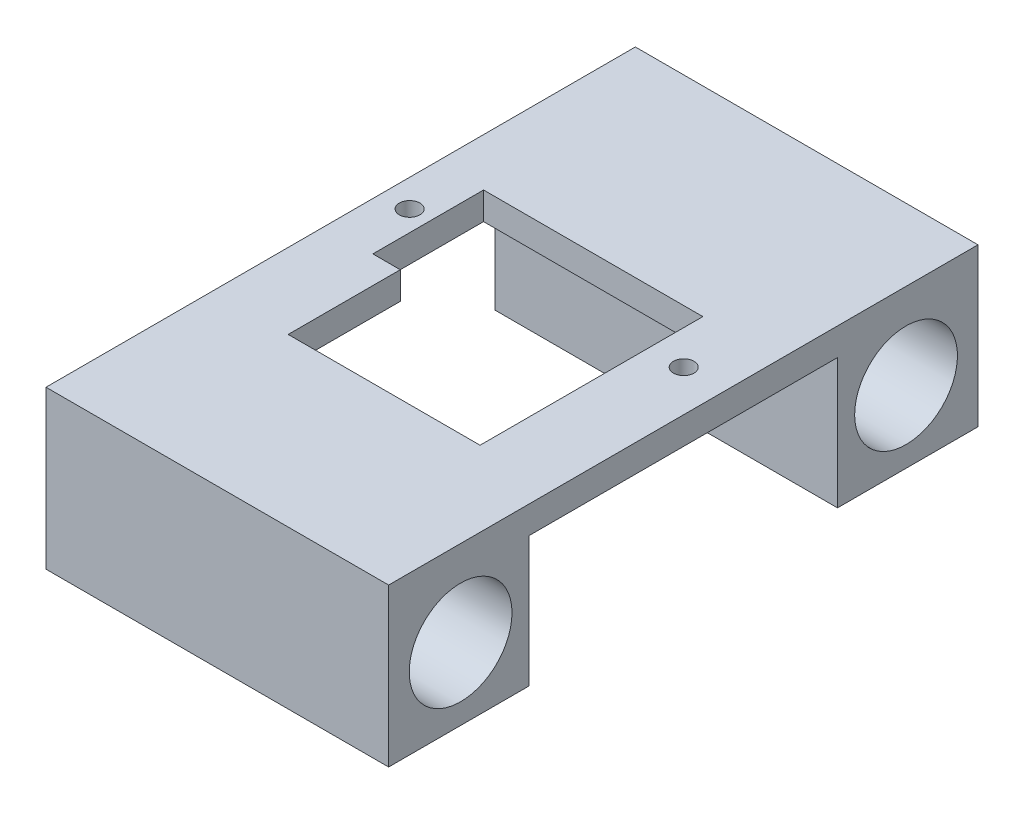
ISO-10303-21;
HEADER;
FILE_DESCRIPTION(('STEP AP214'),'2;1');
FILE_NAME('part.step','',(''),(''),'','','');
FILE_SCHEMA(('AUTOMOTIVE_DESIGN { 1 0 10303 214 1 1 1 1 }'));
ENDSEC;
DATA;
#1=APPLICATION_CONTEXT('core data for automotive mechanical design processes');
#2=APPLICATION_PROTOCOL_DEFINITION('international standard','automotive_design',2000,#1);
#3=PRODUCT_CONTEXT('',#1,'mechanical');
#4=PRODUCT('Part','Part','',(#3));
#5=PRODUCT_RELATED_PRODUCT_CATEGORY('part','',(#4));
#6=PRODUCT_DEFINITION_FORMATION('','',#4);
#7=PRODUCT_DEFINITION_CONTEXT('part definition',#1,'design');
#8=PRODUCT_DEFINITION('design','',#6,#7);
#9=PRODUCT_DEFINITION_SHAPE('','',#8);
#10=(LENGTH_UNIT() NAMED_UNIT(*) SI_UNIT(.MILLI.,.METRE.));
#11=(NAMED_UNIT(*) PLANE_ANGLE_UNIT() SI_UNIT($,.RADIAN.));
#12=(NAMED_UNIT(*) SI_UNIT($,.STERADIAN.) SOLID_ANGLE_UNIT());
#13=UNCERTAINTY_MEASURE_WITH_UNIT(LENGTH_MEASURE(1.E-05),#10,'distance_accuracy_value','');
#14=(GEOMETRIC_REPRESENTATION_CONTEXT(3) GLOBAL_UNCERTAINTY_ASSIGNED_CONTEXT((#13)) GLOBAL_UNIT_ASSIGNED_CONTEXT((#10,
#11,#12)) REPRESENTATION_CONTEXT('',''));
#15=CARTESIAN_POINT('',(0.,0.,0.));
#16=DIRECTION('',(0.,0.,1.));
#17=DIRECTION('',(1.,0.,0.));
#18=AXIS2_PLACEMENT_3D('',#15,#16,#17);
#19=CARTESIAN_POINT('',(-25.,-10.5,32.5));
#20=DIRECTION('',(0.,-1.,0.));
#21=DIRECTION('',(0.,0.,-1.));
#22=AXIS2_PLACEMENT_3D('',#19,#20,#21);
#23=PLANE('',#22);
#24=DIRECTION('',(-1.,0.,0.));
#25=VECTOR('',#24,1.);
#26=CARTESIAN_POINT('',(37.0000000000001,-10.5,-22.5));
#27=LINE('',#26,#25);
#28=CARTESIAN_POINT('',(25.,-10.5,-22.5));
#29=VERTEX_POINT('',#28);
#30=CARTESIAN_POINT('',(-25.,-10.5,-22.5));
#31=VERTEX_POINT('',#30);
#32=EDGE_CURVE('E374',#29,#31,#27,.T.);
#33=ORIENTED_EDGE('',*,*,#32,.T.);
#34=DIRECTION('',(0.,0.,-1.));
#35=VECTOR('',#34,1.);
#36=CARTESIAN_POINT('',(-25.,-10.5,-43.));
#37=LINE('',#36,#35);
#38=CARTESIAN_POINT('',(-25.,-10.5,-43.));
#39=VERTEX_POINT('',#38);
#40=EDGE_CURVE('E168',#31,#39,#37,.T.);
#41=ORIENTED_EDGE('',*,*,#40,.T.);
#42=DIRECTION('',(1.,0.,0.));
#43=VECTOR('',#42,1.);
#44=CARTESIAN_POINT('',(-25.,-10.5,-43.));
#45=LINE('',#44,#43);
#46=CARTESIAN_POINT('',(25.,-10.5,-43.));
#47=VERTEX_POINT('',#46);
#48=EDGE_CURVE('E186',#39,#47,#45,.T.);
#49=ORIENTED_EDGE('',*,*,#48,.T.);
#50=DIRECTION('',(0.,0.,-1.));
#51=VECTOR('',#50,1.);
#52=CARTESIAN_POINT('',(25.,-10.5,32.5));
#53=LINE('',#52,#51);
#54=EDGE_CURVE('E200',#29,#47,#53,.T.);
#55=ORIENTED_EDGE('',*,*,#54,.F.);
#56=EDGE_LOOP('',(#33,#41,#49,#55));
#57=FACE_BOUND('',#56,.T.);
#58=ADVANCED_FACE('F39',(#57),#23,.T.);
#59=DIRECTION('',(-1.,0.,0.));
#60=VECTOR('',#59,1.);
#61=CARTESIAN_POINT('',(37.0000000000001,-10.5,22.5));
#62=LINE('',#61,#60);
#63=CARTESIAN_POINT('',(25.,-10.5,22.5));
#64=VERTEX_POINT('',#63);
#65=CARTESIAN_POINT('',(-25.,-10.5,22.5));
#66=VERTEX_POINT('',#65);
#67=EDGE_CURVE('E138',#64,#66,#62,.T.);
#68=ORIENTED_EDGE('',*,*,#67,.F.);
#69=CARTESIAN_POINT('',(25.,-10.5,43.));
#70=VERTEX_POINT('',#69);
#71=EDGE_CURVE('E175',#70,#64,#53,.T.);
#72=ORIENTED_EDGE('',*,*,#71,.F.);
#73=DIRECTION('',(1.,0.,0.));
#74=VECTOR('',#73,1.);
#75=CARTESIAN_POINT('',(-25.,-10.5,43.));
#76=LINE('',#75,#74);
#77=CARTESIAN_POINT('',(-25.,-10.5,43.));
#78=VERTEX_POINT('',#77);
#79=EDGE_CURVE('E164',#78,#70,#76,.T.);
#80=ORIENTED_EDGE('',*,*,#79,.F.);
#81=EDGE_CURVE('E155',#78,#66,#37,.T.);
#82=ORIENTED_EDGE('',*,*,#81,.T.);
#83=EDGE_LOOP('',(#68,#72,#80,#82));
#84=FACE_BOUND('',#83,.T.);
#85=ADVANCED_FACE('F163',(#84),#23,.T.);
#86=CARTESIAN_POINT('',(-25.,12.5,43.));
#87=DIRECTION('',(0.,0.,1.));
#88=DIRECTION('',(1.,0.,0.));
#89=AXIS2_PLACEMENT_3D('',#86,#87,#88);
#90=PLANE('',#89);
#91=DIRECTION('',(0.,-1.,0.));
#92=VECTOR('',#91,1.);
#93=CARTESIAN_POINT('',(25.,12.5,43.));
#94=LINE('',#93,#92);
#95=CARTESIAN_POINT('',(25.,12.5,43.));
#96=VERTEX_POINT('',#95);
#97=EDGE_CURVE('E196',#96,#70,#94,.T.);
#98=ORIENTED_EDGE('',*,*,#97,.F.);
#99=DIRECTION('',(1.,0.,0.));
#100=VECTOR('',#99,1.);
#101=CARTESIAN_POINT('',(-25.,12.5,43.));
#102=LINE('',#101,#100);
#103=CARTESIAN_POINT('',(-25.,12.5,43.));
#104=VERTEX_POINT('',#103);
#105=EDGE_CURVE('E206',#104,#96,#102,.T.);
#106=ORIENTED_EDGE('',*,*,#105,.F.);
#107=DIRECTION('',(0.,-1.,0.));
#108=VECTOR('',#107,1.);
#109=CARTESIAN_POINT('',(-25.,12.5,43.));
#110=LINE('',#109,#108);
#111=EDGE_CURVE('E183',#104,#78,#110,.T.);
#112=ORIENTED_EDGE('',*,*,#111,.T.);
#113=ORIENTED_EDGE('',*,*,#79,.T.);
#114=EDGE_LOOP('',(#98,#106,#112,#113));
#115=FACE_BOUND('',#114,.T.);
#116=ADVANCED_FACE('F300',(#115),#90,.T.);
#117=CARTESIAN_POINT('',(-25.,12.5,-43.));
#118=DIRECTION('',(0.,1.,0.));
#119=DIRECTION('',(0.,0.,1.));
#120=AXIS2_PLACEMENT_3D('',#117,#118,#119);
#121=PLANE('',#120);
#122=CARTESIAN_POINT('',(-21.0000000000012,12.5,-6.05860568349207));
#123=DIRECTION('',(0.,1.,0.));
#124=DIRECTION('',(0.,0.,1.));
#125=AXIS2_PLACEMENT_3D('',#122,#123,#124);
#126=CIRCLE('',#125,1.50000000000298);
#127=CARTESIAN_POINT('',(-21.0000000000012,12.5,-4.55860568348909));
#128=VERTEX_POINT('',#127);
#129=EDGE_CURVE('E161',#128,#128,#126,.T.);
#130=ORIENTED_EDGE('',*,*,#129,.F.);
#131=EDGE_LOOP('',(#130));
#132=FACE_BOUND('',#131,.T.);
#133=CARTESIAN_POINT('',(18.9999999999988,12.5,-6.05860568349166));
#134=DIRECTION('',(0.,1.,0.));
#135=DIRECTION('',(0.,0.,1.));
#136=AXIS2_PLACEMENT_3D('',#133,#134,#135);
#137=CIRCLE('',#136,1.50000000000299);
#138=CARTESIAN_POINT('',(18.9999999999988,12.5,-4.55860568348867));
#139=VERTEX_POINT('',#138);
#140=EDGE_CURVE('E318',#139,#139,#137,.T.);
#141=ORIENTED_EDGE('',*,*,#140,.F.);
#142=EDGE_LOOP('',(#141));
#143=FACE_BOUND('',#142,.T.);
#144=DIRECTION('',(0.,0.,-1.));
#145=VECTOR('',#144,1.);
#146=CARTESIAN_POINT('',(14.0000000000025,12.5,-43.));
#147=LINE('',#146,#145);
#148=CARTESIAN_POINT('',(14.0000000000025,12.5,18.6606856550326));
#149=VERTEX_POINT('',#148);
#150=CARTESIAN_POINT('',(14.0000000000025,12.5,-13.8507985432631));
#151=VERTEX_POINT('',#150);
#152=EDGE_CURVE('E230',#149,#151,#147,.T.);
#153=ORIENTED_EDGE('',*,*,#152,.F.);
#154=DIRECTION('',(1.,0.,0.));
#155=VECTOR('',#154,1.);
#156=CARTESIAN_POINT('',(-25.,12.5,18.6606856550326));
#157=LINE('',#156,#155);
#158=CARTESIAN_POINT('',(-13.9999999999977,12.5,18.6606856550326));
#159=VERTEX_POINT('',#158);
#160=EDGE_CURVE('E205',#159,#149,#157,.T.);
#161=ORIENTED_EDGE('',*,*,#160,.F.);
#162=DIRECTION('',(2.35448277834634E-13,0.,1.));
#163=VECTOR('',#162,1.);
#164=CARTESIAN_POINT('',(-14.0000000000122,12.5,-43.0000000000026));
#165=LINE('',#164,#163);
#166=CARTESIAN_POINT('',(-14.0000000000015,12.5,2.30428605811857));
#167=VERTEX_POINT('',#166);
#168=EDGE_CURVE('E217',#167,#159,#165,.T.);
#169=ORIENTED_EDGE('',*,*,#168,.F.);
#170=DIRECTION('',(1.,0.,0.));
#171=VECTOR('',#170,1.);
#172=CARTESIAN_POINT('',(-25.,12.5,2.30428605811857));
#173=LINE('',#172,#171);
#174=CARTESIAN_POINT('',(-18.0000000000015,12.5,2.30428605811857));
#175=VERTEX_POINT('',#174);
#176=EDGE_CURVE('E221',#175,#167,#173,.T.);
#177=ORIENTED_EDGE('',*,*,#176,.F.);
#178=DIRECTION('',(0.,0.,1.));
#179=VECTOR('',#178,1.);
#180=CARTESIAN_POINT('',(-18.0000000000018,12.5,-43.));
#181=LINE('',#180,#179);
#182=CARTESIAN_POINT('',(-18.0000000000016,12.5,-13.8507985432631));
#183=VERTEX_POINT('',#182);
#184=EDGE_CURVE('E224',#183,#175,#181,.T.);
#185=ORIENTED_EDGE('',*,*,#184,.F.);
#186=DIRECTION('',(-1.,0.,0.));
#187=VECTOR('',#186,1.);
#188=CARTESIAN_POINT('',(-25.,12.5,-13.8507985432631));
#189=LINE('',#188,#187);
#190=EDGE_CURVE('E227',#151,#183,#189,.T.);
#191=ORIENTED_EDGE('',*,*,#190,.F.);
#192=EDGE_LOOP('',(#153,#161,#169,#177,#185,#191));
#193=FACE_BOUND('',#192,.T.);
#194=DIRECTION('',(0.,0.,1.));
#195=VECTOR('',#194,1.);
#196=CARTESIAN_POINT('',(25.,12.5,-43.));
#197=LINE('',#196,#195);
#198=CARTESIAN_POINT('',(25.,12.5,-43.));
#199=VERTEX_POINT('',#198);
#200=EDGE_CURVE('E191',#199,#96,#197,.T.);
#201=ORIENTED_EDGE('',*,*,#200,.F.);
#202=DIRECTION('',(1.,0.,0.));
#203=VECTOR('',#202,1.);
#204=CARTESIAN_POINT('',(-25.,12.5,-43.));
#205=LINE('',#204,#203);
#206=CARTESIAN_POINT('',(-25.,12.5,-43.));
#207=VERTEX_POINT('',#206);
#208=EDGE_CURVE('E209',#207,#199,#205,.T.);
#209=ORIENTED_EDGE('',*,*,#208,.F.);
#210=DIRECTION('',(0.,0.,1.));
#211=VECTOR('',#210,1.);
#212=CARTESIAN_POINT('',(-25.,12.5,-43.));
#213=LINE('',#212,#211);
#214=EDGE_CURVE('E173',#207,#104,#213,.T.);
#215=ORIENTED_EDGE('',*,*,#214,.T.);
#216=ORIENTED_EDGE('',*,*,#105,.T.);
#217=EDGE_LOOP('',(#201,#209,#215,#216));
#218=FACE_BOUND('',#217,.T.);
#219=ADVANCED_FACE('F304',(#132,#143,#193,#218),#121,.T.);
#220=CARTESIAN_POINT('',(-25.,-10.5,-43.));
#221=DIRECTION('',(0.,0.,-1.));
#222=DIRECTION('',(-1.,0.,0.));
#223=AXIS2_PLACEMENT_3D('',#220,#221,#222);
#224=PLANE('',#223);
#225=DIRECTION('',(0.,1.,0.));
#226=VECTOR('',#225,1.);
#227=CARTESIAN_POINT('',(25.,-10.5,-43.));
#228=LINE('',#227,#226);
#229=EDGE_CURVE('E187',#47,#199,#228,.T.);
#230=ORIENTED_EDGE('',*,*,#229,.F.);
#231=ORIENTED_EDGE('',*,*,#48,.F.);
#232=DIRECTION('',(0.,1.,0.));
#233=VECTOR('',#232,1.);
#234=CARTESIAN_POINT('',(-25.,-10.5,-43.));
#235=LINE('',#234,#233);
#236=EDGE_CURVE('E167',#39,#207,#235,.T.);
#237=ORIENTED_EDGE('',*,*,#236,.T.);
#238=ORIENTED_EDGE('',*,*,#208,.T.);
#239=EDGE_LOOP('',(#230,#231,#237,#238));
#240=FACE_BOUND('',#239,.T.);
#241=ADVANCED_FACE('F41',(#240),#224,.T.);
#242=CARTESIAN_POINT('',(-25.,0.,0.));
#243=DIRECTION('',(1.,0.,0.));
#244=DIRECTION('',(0.,0.,-1.));
#245=AXIS2_PLACEMENT_3D('',#242,#243,#244);
#246=PLANE('',#245);
#247=CARTESIAN_POINT('',(-25.,0.,-32.5));
#248=DIRECTION('',(1.,0.,0.));
#249=DIRECTION('',(0.,0.,1.));
#250=AXIS2_PLACEMENT_3D('',#247,#248,#249);
#251=CIRCLE('',#250,7.5);
#252=CARTESIAN_POINT('',(-25.,0.,-25.));
#253=VERTEX_POINT('',#252);
#254=EDGE_CURVE('E261',#253,#253,#251,.T.);
#255=ORIENTED_EDGE('',*,*,#254,.T.);
#256=EDGE_LOOP('',(#255));
#257=FACE_BOUND('',#256,.T.);
#258=CARTESIAN_POINT('',(-25.,0.,32.5));
#259=DIRECTION('',(1.,0.,0.));
#260=DIRECTION('',(0.,0.,-1.));
#261=AXIS2_PLACEMENT_3D('',#258,#259,#260);
#262=CIRCLE('',#261,7.5);
#263=CARTESIAN_POINT('',(-25.,0.,25.));
#264=VERTEX_POINT('',#263);
#265=EDGE_CURVE('E192',#264,#264,#262,.T.);
#266=ORIENTED_EDGE('',*,*,#265,.T.);
#267=EDGE_LOOP('',(#266));
#268=FACE_BOUND('',#267,.T.);
#269=ORIENTED_EDGE('',*,*,#40,.F.);
#270=DIRECTION('',(0.,-1.,0.));
#271=VECTOR('',#270,1.);
#272=CARTESIAN_POINT('',(-25.,-10.5,-22.5));
#273=LINE('',#272,#271);
#274=CARTESIAN_POINT('',(-25.,8.5,-22.5));
#275=VERTEX_POINT('',#274);
#276=EDGE_CURVE('E149',#275,#31,#273,.T.);
#277=ORIENTED_EDGE('',*,*,#276,.F.);
#278=DIRECTION('',(0.,0.,-1.));
#279=VECTOR('',#278,1.);
#280=CARTESIAN_POINT('',(-25.,8.5,-22.5));
#281=LINE('',#280,#279);
#282=CARTESIAN_POINT('',(-25.,8.5,22.5));
#283=VERTEX_POINT('',#282);
#284=EDGE_CURVE('E159',#283,#275,#281,.T.);
#285=ORIENTED_EDGE('',*,*,#284,.F.);
#286=DIRECTION('',(0.,1.,0.));
#287=VECTOR('',#286,1.);
#288=CARTESIAN_POINT('',(-25.,8.5,22.5));
#289=LINE('',#288,#287);
#290=EDGE_CURVE('E141',#66,#283,#289,.T.);
#291=ORIENTED_EDGE('',*,*,#290,.F.);
#292=ORIENTED_EDGE('',*,*,#81,.F.);
#293=ORIENTED_EDGE('',*,*,#111,.F.);
#294=ORIENTED_EDGE('',*,*,#214,.F.);
#295=ORIENTED_EDGE('',*,*,#236,.F.);
#296=EDGE_LOOP('',(#269,#277,#285,#291,#292,#293,#294,#295));
#297=FACE_BOUND('',#296,.T.);
#298=ADVANCED_FACE('F153',(#257,#268,#297),#246,.F.);
#299=CARTESIAN_POINT('',(25.,0.,0.));
#300=DIRECTION('',(1.,0.,0.));
#301=DIRECTION('',(0.,0.,-1.));
#302=AXIS2_PLACEMENT_3D('',#299,#300,#301);
#303=PLANE('',#302);
#304=DIRECTION('',(0.,1.,0.));
#305=VECTOR('',#304,1.);
#306=CARTESIAN_POINT('',(25.,0.,-22.5));
#307=LINE('',#306,#305);
#308=CARTESIAN_POINT('',(25.,8.5,-22.5));
#309=VERTEX_POINT('',#308);
#310=EDGE_CURVE('E11',#29,#309,#307,.T.);
#311=ORIENTED_EDGE('',*,*,#310,.F.);
#312=ORIENTED_EDGE('',*,*,#54,.T.);
#313=ORIENTED_EDGE('',*,*,#229,.T.);
#314=ORIENTED_EDGE('',*,*,#200,.T.);
#315=ORIENTED_EDGE('',*,*,#97,.T.);
#316=ORIENTED_EDGE('',*,*,#71,.T.);
#317=DIRECTION('',(0.,-1.,0.));
#318=VECTOR('',#317,1.);
#319=CARTESIAN_POINT('',(25.,0.,22.5));
#320=LINE('',#319,#318);
#321=CARTESIAN_POINT('',(25.,8.5,22.5));
#322=VERTEX_POINT('',#321);
#323=EDGE_CURVE('E48',#322,#64,#320,.T.);
#324=ORIENTED_EDGE('',*,*,#323,.F.);
#325=DIRECTION('',(0.,0.,1.));
#326=VECTOR('',#325,1.);
#327=CARTESIAN_POINT('',(25.,8.5,0.));
#328=LINE('',#327,#326);
#329=EDGE_CURVE('E257',#309,#322,#328,.T.);
#330=ORIENTED_EDGE('',*,*,#329,.F.);
#331=EDGE_LOOP('',(#311,#312,#313,#314,#315,#316,#324,#330));
#332=FACE_BOUND('',#331,.T.);
#333=CARTESIAN_POINT('',(25.,0.,-32.5));
#334=DIRECTION('',(1.,0.,0.));
#335=DIRECTION('',(0.,0.,1.));
#336=AXIS2_PLACEMENT_3D('',#333,#334,#335);
#337=CIRCLE('',#336,7.5);
#338=CARTESIAN_POINT('',(25.,0.,-25.));
#339=VERTEX_POINT('',#338);
#340=EDGE_CURVE('E265',#339,#339,#337,.T.);
#341=ORIENTED_EDGE('',*,*,#340,.F.);
#342=EDGE_LOOP('',(#341));
#343=FACE_BOUND('',#342,.T.);
#344=CARTESIAN_POINT('',(25.,0.,32.5));
#345=DIRECTION('',(1.,0.,0.));
#346=DIRECTION('',(0.,0.,-1.));
#347=AXIS2_PLACEMENT_3D('',#344,#345,#346);
#348=CIRCLE('',#347,7.5);
#349=CARTESIAN_POINT('',(25.,0.,25.));
#350=VERTEX_POINT('',#349);
#351=EDGE_CURVE('E177',#350,#350,#348,.T.);
#352=ORIENTED_EDGE('',*,*,#351,.F.);
#353=EDGE_LOOP('',(#352));
#354=FACE_BOUND('',#353,.T.);
#355=ADVANCED_FACE('F279',(#332,#343,#354),#303,.T.);
#356=CARTESIAN_POINT('',(-25.,0.,32.5));
#357=DIRECTION('',(1.,0.,0.));
#358=DIRECTION('',(0.,0.,-1.));
#359=AXIS2_PLACEMENT_3D('',#356,#357,#358);
#360=CYLINDRICAL_SURFACE('',#359,7.5);
#361=ORIENTED_EDGE('',*,*,#265,.F.);
#362=EDGE_LOOP('',(#361));
#363=FACE_BOUND('',#362,.T.);
#364=ORIENTED_EDGE('',*,*,#351,.T.);
#365=EDGE_LOOP('',(#364));
#366=FACE_BOUND('',#365,.T.);
#367=ADVANCED_FACE('F277',(#363,#366),#360,.F.);
#368=CARTESIAN_POINT('',(-25.,0.,-32.5));
#369=DIRECTION('',(1.,0.,0.));
#370=DIRECTION('',(0.,0.,-1.));
#371=AXIS2_PLACEMENT_3D('',#368,#369,#370);
#372=CYLINDRICAL_SURFACE('',#371,7.5);
#373=ORIENTED_EDGE('',*,*,#254,.F.);
#374=EDGE_LOOP('',(#373));
#375=FACE_BOUND('',#374,.T.);
#376=ORIENTED_EDGE('',*,*,#340,.T.);
#377=EDGE_LOOP('',(#376));
#378=FACE_BOUND('',#377,.T.);
#379=ADVANCED_FACE('F287',(#375,#378),#372,.F.);
#380=CARTESIAN_POINT('',(14.0000000000025,23.5,-13.8507985432631));
#381=DIRECTION('',(1.,0.,0.));
#382=DIRECTION('',(0.,0.,-1.));
#383=AXIS2_PLACEMENT_3D('',#380,#381,#382);
#384=PLANE('',#383);
#385=DIRECTION('',(0.,-1.,0.));
#386=VECTOR('',#385,1.);
#387=CARTESIAN_POINT('',(14.0000000000025,23.5,-13.8507985432631));
#388=LINE('',#387,#386);
#389=CARTESIAN_POINT('',(14.0000000000025,8.5,-13.8507985432631));
#390=VERTEX_POINT('',#389);
#391=EDGE_CURVE('E268',#151,#390,#388,.T.);
#392=ORIENTED_EDGE('',*,*,#391,.T.);
#393=DIRECTION('',(0.,0.,1.));
#394=VECTOR('',#393,1.);
#395=CARTESIAN_POINT('',(14.0000000000025,8.5,-13.8507985432631));
#396=LINE('',#395,#394);
#397=CARTESIAN_POINT('',(14.0000000000025,8.5,18.6606856550326));
#398=VERTEX_POINT('',#397);
#399=EDGE_CURVE('E333',#390,#398,#396,.T.);
#400=ORIENTED_EDGE('',*,*,#399,.T.);
#401=DIRECTION('',(0.,-1.,0.));
#402=VECTOR('',#401,1.);
#403=CARTESIAN_POINT('',(14.0000000000025,23.5,18.6606856550326));
#404=LINE('',#403,#402);
#405=EDGE_CURVE('E242',#149,#398,#404,.T.);
#406=ORIENTED_EDGE('',*,*,#405,.F.);
#407=ORIENTED_EDGE('',*,*,#152,.T.);
#408=EDGE_LOOP('',(#392,#400,#406,#407));
#409=FACE_BOUND('',#408,.T.);
#410=ADVANCED_FACE('F361',(#409),#384,.F.);
#411=CARTESIAN_POINT('',(14.0000000000025,23.5,-13.8507985432631));
#412=DIRECTION('',(0.,0.,-1.));
#413=DIRECTION('',(-1.,0.,0.));
#414=AXIS2_PLACEMENT_3D('',#411,#412,#413);
#415=PLANE('',#414);
#416=DIRECTION('',(0.,-1.,0.));
#417=VECTOR('',#416,1.);
#418=CARTESIAN_POINT('',(-18.0000000000016,23.5,-13.8507985432631));
#419=LINE('',#418,#417);
#420=CARTESIAN_POINT('',(-18.0000000000016,8.5,-13.8507985432631));
#421=VERTEX_POINT('',#420);
#422=EDGE_CURVE('E343',#183,#421,#419,.T.);
#423=ORIENTED_EDGE('',*,*,#422,.T.);
#424=DIRECTION('',(1.,0.,0.));
#425=VECTOR('',#424,1.);
#426=CARTESIAN_POINT('',(14.0000000000025,8.5,-13.8507985432631));
#427=LINE('',#426,#425);
#428=EDGE_CURVE('E336',#421,#390,#427,.T.);
#429=ORIENTED_EDGE('',*,*,#428,.T.);
#430=ORIENTED_EDGE('',*,*,#391,.F.);
#431=ORIENTED_EDGE('',*,*,#190,.T.);
#432=EDGE_LOOP('',(#423,#429,#430,#431));
#433=FACE_BOUND('',#432,.T.);
#434=ADVANCED_FACE('F366',(#433),#415,.F.);
#435=CARTESIAN_POINT('',(-18.0000000000016,23.5,-13.8507985432631));
#436=DIRECTION('',(-1.,0.,0.));
#437=DIRECTION('',(0.,0.,1.));
#438=AXIS2_PLACEMENT_3D('',#435,#436,#437);
#439=PLANE('',#438);
#440=DIRECTION('',(0.,-1.,0.));
#441=VECTOR('',#440,1.);
#442=CARTESIAN_POINT('',(-18.0000000000015,23.5,2.30428605811857));
#443=LINE('',#442,#441);
#444=CARTESIAN_POINT('',(-18.0000000000015,8.5,2.30428605811857));
#445=VERTEX_POINT('',#444);
#446=EDGE_CURVE('E255',#175,#445,#443,.T.);
#447=ORIENTED_EDGE('',*,*,#446,.T.);
#448=DIRECTION('',(0.,0.,-1.));
#449=VECTOR('',#448,1.);
#450=CARTESIAN_POINT('',(-18.0000000000016,8.5,-13.8507985432631));
#451=LINE('',#450,#449);
#452=EDGE_CURVE('E353',#445,#421,#451,.T.);
#453=ORIENTED_EDGE('',*,*,#452,.T.);
#454=ORIENTED_EDGE('',*,*,#422,.F.);
#455=ORIENTED_EDGE('',*,*,#184,.T.);
#456=EDGE_LOOP('',(#447,#453,#454,#455));
#457=FACE_BOUND('',#456,.T.);
#458=ADVANCED_FACE('F351',(#457),#439,.F.);
#459=CARTESIAN_POINT('',(-18.0000000000015,23.5,2.30428605811857));
#460=DIRECTION('',(0.,0.,1.));
#461=DIRECTION('',(1.,0.,0.));
#462=AXIS2_PLACEMENT_3D('',#459,#460,#461);
#463=PLANE('',#462);
#464=DIRECTION('',(0.,-1.,0.));
#465=VECTOR('',#464,1.);
#466=CARTESIAN_POINT('',(-14.0000000000015,23.5,2.30428605811857));
#467=LINE('',#466,#465);
#468=CARTESIAN_POINT('',(-14.0000000000015,8.5,2.30428605811857));
#469=VERTEX_POINT('',#468);
#470=EDGE_CURVE('E251',#167,#469,#467,.T.);
#471=ORIENTED_EDGE('',*,*,#470,.T.);
#472=DIRECTION('',(-1.,0.,0.));
#473=VECTOR('',#472,1.);
#474=CARTESIAN_POINT('',(-18.0000000000015,8.5,2.30428605811857));
#475=LINE('',#474,#473);
#476=EDGE_CURVE('E359',#469,#445,#475,.T.);
#477=ORIENTED_EDGE('',*,*,#476,.T.);
#478=ORIENTED_EDGE('',*,*,#446,.F.);
#479=ORIENTED_EDGE('',*,*,#176,.T.);
#480=EDGE_LOOP('',(#471,#477,#478,#479));
#481=FACE_BOUND('',#480,.T.);
#482=ADVANCED_FACE('F358',(#481),#463,.F.);
#483=CARTESIAN_POINT('',(-14.0000000000015,23.5,2.30428605811857));
#484=DIRECTION('',(-1.,0.,2.35448277834634E-13));
#485=DIRECTION('',(2.35448277834634E-13,0.,1.));
#486=AXIS2_PLACEMENT_3D('',#483,#484,#485);
#487=PLANE('',#486);
#488=DIRECTION('',(0.,-1.,0.));
#489=VECTOR('',#488,1.);
#490=CARTESIAN_POINT('',(-13.9999999999977,23.5,18.6606856550326));
#491=LINE('',#490,#489);
#492=CARTESIAN_POINT('',(-13.9999999999977,8.5,18.6606856550326));
#493=VERTEX_POINT('',#492);
#494=EDGE_CURVE('E240',#159,#493,#491,.T.);
#495=ORIENTED_EDGE('',*,*,#494,.T.);
#496=DIRECTION('',(-2.35448277834634E-13,0.,-1.));
#497=VECTOR('',#496,1.);
#498=CARTESIAN_POINT('',(-14.0000000000015,8.5,2.30428605811857));
#499=LINE('',#498,#497);
#500=EDGE_CURVE('E63',#493,#469,#499,.T.);
#501=ORIENTED_EDGE('',*,*,#500,.T.);
#502=ORIENTED_EDGE('',*,*,#470,.F.);
#503=ORIENTED_EDGE('',*,*,#168,.T.);
#504=EDGE_LOOP('',(#495,#501,#502,#503));
#505=FACE_BOUND('',#504,.T.);
#506=ADVANCED_FACE('F245',(#505),#487,.F.);
#507=CARTESIAN_POINT('',(-13.9999999999977,23.5,18.6606856550326));
#508=DIRECTION('',(0.,0.,1.));
#509=DIRECTION('',(1.,0.,0.));
#510=AXIS2_PLACEMENT_3D('',#507,#508,#509);
#511=PLANE('',#510);
#512=ORIENTED_EDGE('',*,*,#405,.T.);
#513=DIRECTION('',(-1.,0.,0.));
#514=VECTOR('',#513,1.);
#515=CARTESIAN_POINT('',(-13.9999999999977,8.5,18.6606856550326));
#516=LINE('',#515,#514);
#517=EDGE_CURVE('E233',#398,#493,#516,.T.);
#518=ORIENTED_EDGE('',*,*,#517,.T.);
#519=ORIENTED_EDGE('',*,*,#494,.F.);
#520=ORIENTED_EDGE('',*,*,#160,.T.);
#521=EDGE_LOOP('',(#512,#518,#519,#520));
#522=FACE_BOUND('',#521,.T.);
#523=ADVANCED_FACE('F239',(#522),#511,.F.);
#524=CARTESIAN_POINT('',(37.0000000000001,8.5,-22.5));
#525=DIRECTION('',(0.,1.,0.));
#526=DIRECTION('',(0.,0.,1.));
#527=AXIS2_PLACEMENT_3D('',#524,#525,#526);
#528=PLANE('',#527);
#529=CARTESIAN_POINT('',(-21.0000000000012,8.5,-6.05860568349207));
#530=DIRECTION('',(0.,-1.,0.));
#531=DIRECTION('',(0.,0.,-1.));
#532=AXIS2_PLACEMENT_3D('',#529,#530,#531);
#533=CIRCLE('',#532,1.50000000000298);
#534=CARTESIAN_POINT('',(-21.0000000000012,8.5,-7.55860568349505));
#535=VERTEX_POINT('',#534);
#536=EDGE_CURVE('E391',#535,#535,#533,.T.);
#537=ORIENTED_EDGE('',*,*,#536,.F.);
#538=EDGE_LOOP('',(#537));
#539=FACE_BOUND('',#538,.T.);
#540=CARTESIAN_POINT('',(18.9999999999988,8.5,-6.05860568349166));
#541=DIRECTION('',(0.,-1.,0.));
#542=DIRECTION('',(0.,0.,-1.));
#543=AXIS2_PLACEMENT_3D('',#540,#541,#542);
#544=CIRCLE('',#543,1.50000000000299);
#545=CARTESIAN_POINT('',(18.9999999999988,8.5,-7.55860568349464));
#546=VERTEX_POINT('',#545);
#547=EDGE_CURVE('E392',#546,#546,#544,.T.);
#548=ORIENTED_EDGE('',*,*,#547,.F.);
#549=EDGE_LOOP('',(#548));
#550=FACE_BOUND('',#549,.T.);
#551=ORIENTED_EDGE('',*,*,#329,.T.);
#552=DIRECTION('',(-1.,0.,0.));
#553=VECTOR('',#552,1.);
#554=CARTESIAN_POINT('',(37.0000000000001,8.5,22.5));
#555=LINE('',#554,#553);
#556=EDGE_CURVE('E55',#322,#283,#555,.T.);
#557=ORIENTED_EDGE('',*,*,#556,.T.);
#558=ORIENTED_EDGE('',*,*,#284,.T.);
#559=DIRECTION('',(-1.,0.,0.));
#560=VECTOR('',#559,1.);
#561=CARTESIAN_POINT('',(37.0000000000001,8.5,-22.5));
#562=LINE('',#561,#560);
#563=EDGE_CURVE('E378',#309,#275,#562,.T.);
#564=ORIENTED_EDGE('',*,*,#563,.F.);
#565=EDGE_LOOP('',(#551,#557,#558,#564));
#566=FACE_BOUND('',#565,.T.);
#567=ORIENTED_EDGE('',*,*,#428,.F.);
#568=ORIENTED_EDGE('',*,*,#452,.F.);
#569=ORIENTED_EDGE('',*,*,#476,.F.);
#570=ORIENTED_EDGE('',*,*,#500,.F.);
#571=ORIENTED_EDGE('',*,*,#517,.F.);
#572=ORIENTED_EDGE('',*,*,#399,.F.);
#573=EDGE_LOOP('',(#567,#568,#569,#570,#571,#572));
#574=FACE_BOUND('',#573,.T.);
#575=ADVANCED_FACE('F364',(#539,#550,#566,#574),#528,.F.);
#576=CARTESIAN_POINT('',(37.0000000000001,-10.5,-22.5));
#577=DIRECTION('',(0.,0.,-1.));
#578=DIRECTION('',(-1.,0.,0.));
#579=AXIS2_PLACEMENT_3D('',#576,#577,#578);
#580=PLANE('',#579);
#581=ORIENTED_EDGE('',*,*,#310,.T.);
#582=ORIENTED_EDGE('',*,*,#563,.T.);
#583=ORIENTED_EDGE('',*,*,#276,.T.);
#584=ORIENTED_EDGE('',*,*,#32,.F.);
#585=EDGE_LOOP('',(#581,#582,#583,#584));
#586=FACE_BOUND('',#585,.T.);
#587=ADVANCED_FACE('F404',(#586),#580,.F.);
#588=CARTESIAN_POINT('',(37.0000000000001,8.5,22.5));
#589=DIRECTION('',(0.,0.,1.));
#590=DIRECTION('',(0.,-1.,0.));
#591=AXIS2_PLACEMENT_3D('',#588,#589,#590);
#592=PLANE('',#591);
#593=ORIENTED_EDGE('',*,*,#323,.T.);
#594=ORIENTED_EDGE('',*,*,#67,.T.);
#595=ORIENTED_EDGE('',*,*,#290,.T.);
#596=ORIENTED_EDGE('',*,*,#556,.F.);
#597=EDGE_LOOP('',(#593,#594,#595,#596));
#598=FACE_BOUND('',#597,.T.);
#599=ADVANCED_FACE('F140',(#598),#592,.F.);
#600=CARTESIAN_POINT('',(18.9999999999988,70.5000000000001,-6.05860568349166));
#601=DIRECTION('',(0.,-1.,0.));
#602=DIRECTION('',(0.,0.,-1.));
#603=AXIS2_PLACEMENT_3D('',#600,#601,#602);
#604=CYLINDRICAL_SURFACE('',#603,1.50000000000299);
#605=ORIENTED_EDGE('',*,*,#140,.T.);
#606=EDGE_LOOP('',(#605));
#607=FACE_BOUND('',#606,.T.);
#608=ORIENTED_EDGE('',*,*,#547,.T.);
#609=EDGE_LOOP('',(#608));
#610=FACE_BOUND('',#609,.T.);
#611=ADVANCED_FACE('F408',(#607,#610),#604,.F.);
#612=CARTESIAN_POINT('',(-21.0000000000012,70.5000000000001,-6.05860568349207));
#613=DIRECTION('',(0.,-1.,0.));
#614=DIRECTION('',(0.,0.,-1.));
#615=AXIS2_PLACEMENT_3D('',#612,#613,#614);
#616=CYLINDRICAL_SURFACE('',#615,1.50000000000298);
#617=ORIENTED_EDGE('',*,*,#129,.T.);
#618=EDGE_LOOP('',(#617));
#619=FACE_BOUND('',#618,.T.);
#620=ORIENTED_EDGE('',*,*,#536,.T.);
#621=EDGE_LOOP('',(#620));
#622=FACE_BOUND('',#621,.T.);
#623=ADVANCED_FACE('F400',(#619,#622),#616,.F.);
#624=CLOSED_SHELL('',(#58,#85,#116,#219,#241,#298,#355,#367,#379,#410,#434,#458,#482,#506,#523,
#575,#587,#599,#611,#623));
#625=MANIFOLD_SOLID_BREP('B2',#624);
#626=ADVANCED_BREP_SHAPE_REPRESENTATION('',(#18,#625),#14);
#627=SHAPE_DEFINITION_REPRESENTATION(#9,#626);
ENDSEC;
END-ISO-10303-21;
